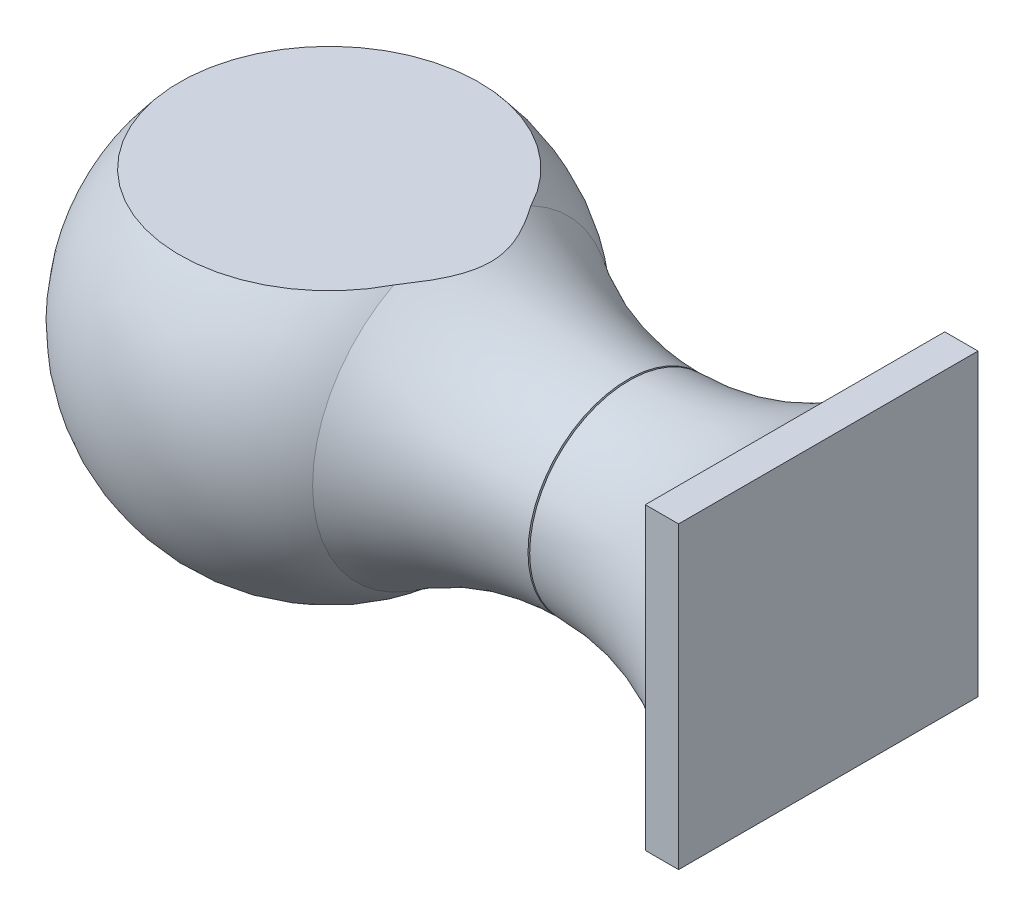
ISO-10303-21;
HEADER;
FILE_DESCRIPTION(('STEP AP214'),'2;1');
FILE_NAME('part.step','',(''),(''),'','','');
FILE_SCHEMA(('AUTOMOTIVE_DESIGN { 1 0 10303 214 1 1 1 1 }'));
ENDSEC;
DATA;
#1=APPLICATION_CONTEXT('core data for automotive mechanical design processes');
#2=APPLICATION_PROTOCOL_DEFINITION('international standard','automotive_design',2000,#1);
#3=PRODUCT_CONTEXT('',#1,'mechanical');
#4=PRODUCT('Part','Part','',(#3));
#5=PRODUCT_RELATED_PRODUCT_CATEGORY('part','',(#4));
#6=PRODUCT_DEFINITION_FORMATION('','',#4);
#7=PRODUCT_DEFINITION_CONTEXT('part definition',#1,'design');
#8=PRODUCT_DEFINITION('design','',#6,#7);
#9=PRODUCT_DEFINITION_SHAPE('','',#8);
#10=(LENGTH_UNIT() NAMED_UNIT(*) SI_UNIT(.MILLI.,.METRE.));
#11=(NAMED_UNIT(*) PLANE_ANGLE_UNIT() SI_UNIT($,.RADIAN.));
#12=(NAMED_UNIT(*) SI_UNIT($,.STERADIAN.) SOLID_ANGLE_UNIT());
#13=UNCERTAINTY_MEASURE_WITH_UNIT(LENGTH_MEASURE(1.E-05),#10,'distance_accuracy_value','');
#14=(GEOMETRIC_REPRESENTATION_CONTEXT(3) GLOBAL_UNCERTAINTY_ASSIGNED_CONTEXT((#13)) GLOBAL_UNIT_ASSIGNED_CONTEXT((#10,
#11,#12)) REPRESENTATION_CONTEXT('',''));
#15=CARTESIAN_POINT('',(0.,0.,0.));
#16=DIRECTION('',(0.,0.,1.));
#17=DIRECTION('',(1.,0.,0.));
#18=AXIS2_PLACEMENT_3D('',#15,#16,#17);
#19=CARTESIAN_POINT('',(0.,0.,0.));
#20=DIRECTION('',(-1.,0.,0.));
#21=DIRECTION('',(0.,0.,1.));
#22=AXIS2_PLACEMENT_3D('',#19,#20,#21);
#23=TOROIDAL_SURFACE('',#22,120.833333333333,90.8333333333334);
#24=CARTESIAN_POINT('',(0.249999999999993,0.,0.));
#25=DIRECTION('',(-1.,0.,0.));
#26=DIRECTION('',(0.,0.,1.));
#27=AXIS2_PLACEMENT_3D('',#24,#25,#26);
#28=CIRCLE('',#27,30.0003440373488);
#29=CARTESIAN_POINT('',(0.249999999999989,0.,30.0003440373488));
#30=VERTEX_POINT('',#29);
#31=EDGE_CURVE('E12',#30,#30,#28,.T.);
#32=ORIENTED_EDGE('',*,*,#31,.F.);
#33=EDGE_LOOP('',(#32));
#34=FACE_BOUND('',#33,.T.);
#35=CARTESIAN_POINT('',(50.,0.,0.));
#36=DIRECTION('',(-1.,0.,0.));
#37=DIRECTION('',(0.,0.,1.));
#38=AXIS2_PLACEMENT_3D('',#35,#36,#37);
#39=CIRCLE('',#38,45.);
#40=CARTESIAN_POINT('',(50.,0.,45.));
#41=VERTEX_POINT('',#40);
#42=CARTESIAN_POINT('',(50.,45.,0.));
#43=VERTEX_POINT('',#42);
#44=EDGE_CURVE('E50',#41,#43,#39,.T.);
#45=ORIENTED_EDGE('',*,*,#44,.T.);
#46=CARTESIAN_POINT('',(50.,0.,-45.));
#47=VERTEX_POINT('',#46);
#48=EDGE_CURVE('E65',#43,#47,#39,.T.);
#49=ORIENTED_EDGE('',*,*,#48,.T.);
#50=CARTESIAN_POINT('',(50.,-45.,0.));
#51=VERTEX_POINT('',#50);
#52=EDGE_CURVE('E125',#47,#51,#39,.T.);
#53=ORIENTED_EDGE('',*,*,#52,.T.);
#54=EDGE_CURVE('E122',#51,#41,#39,.T.);
#55=ORIENTED_EDGE('',*,*,#54,.T.);
#56=EDGE_LOOP('',(#45,#49,#53,#55));
#57=FACE_BOUND('',#56,.T.);
#58=ADVANCED_FACE('F43',(#34,#57),#23,.F.);
#59=CARTESIAN_POINT('',(0.250000000000007,0.,-30.0003440373488));
#60=DIRECTION('',(1.,0.,0.));
#61=DIRECTION('',(0.,0.,-1.));
#62=AXIS2_PLACEMENT_3D('',#59,#60,#61);
#63=PLANE('',#62);
#64=ORIENTED_EDGE('',*,*,#31,.T.);
#65=EDGE_LOOP('',(#64));
#66=FACE_BOUND('',#65,.T.);
#67=ADVANCED_FACE('F171',(#66),#63,.F.);
#68=CARTESIAN_POINT('',(50.,0.,0.));
#69=DIRECTION('',(1.,0.,0.));
#70=DIRECTION('',(0.,0.,-1.));
#71=AXIS2_PLACEMENT_3D('',#68,#69,#70);
#72=PLANE('',#71);
#73=ORIENTED_EDGE('',*,*,#44,.F.);
#74=DIRECTION('',(0.,-1.,0.));
#75=VECTOR('',#74,1.);
#76=CARTESIAN_POINT('',(50.,45.,45.));
#77=LINE('',#76,#75);
#78=CARTESIAN_POINT('',(50.,45.,45.));
#79=VERTEX_POINT('',#78);
#80=EDGE_CURVE('E57',#79,#41,#77,.T.);
#81=ORIENTED_EDGE('',*,*,#80,.F.);
#82=DIRECTION('',(0.,0.,1.));
#83=VECTOR('',#82,1.);
#84=CARTESIAN_POINT('',(50.,45.,45.));
#85=LINE('',#84,#83);
#86=EDGE_CURVE('E144',#43,#79,#85,.T.);
#87=ORIENTED_EDGE('',*,*,#86,.F.);
#88=EDGE_LOOP('',(#73,#81,#87));
#89=FACE_BOUND('',#88,.T.);
#90=ADVANCED_FACE('F160',(#89),#72,.F.);
#91=ORIENTED_EDGE('',*,*,#48,.F.);
#92=CARTESIAN_POINT('',(50.,45.,-45.));
#93=VERTEX_POINT('',#92);
#94=EDGE_CURVE('E141',#93,#43,#85,.T.);
#95=ORIENTED_EDGE('',*,*,#94,.F.);
#96=DIRECTION('',(0.,1.,0.));
#97=VECTOR('',#96,1.);
#98=CARTESIAN_POINT('',(50.,45.,-45.));
#99=LINE('',#98,#97);
#100=EDGE_CURVE('E121',#47,#93,#99,.T.);
#101=ORIENTED_EDGE('',*,*,#100,.F.);
#102=EDGE_LOOP('',(#91,#95,#101));
#103=FACE_BOUND('',#102,.T.);
#104=ADVANCED_FACE('F140',(#103),#72,.F.);
#105=ORIENTED_EDGE('',*,*,#52,.F.);
#106=CARTESIAN_POINT('',(50.,-45.,-45.));
#107=VERTEX_POINT('',#106);
#108=EDGE_CURVE('E137',#107,#47,#99,.T.);
#109=ORIENTED_EDGE('',*,*,#108,.F.);
#110=DIRECTION('',(0.,0.,-1.));
#111=VECTOR('',#110,1.);
#112=CARTESIAN_POINT('',(50.,-45.,45.));
#113=LINE('',#112,#111);
#114=EDGE_CURVE('E138',#51,#107,#113,.T.);
#115=ORIENTED_EDGE('',*,*,#114,.F.);
#116=EDGE_LOOP('',(#105,#109,#115));
#117=FACE_BOUND('',#116,.T.);
#118=ADVANCED_FACE('F136',(#117),#72,.F.);
#119=CARTESIAN_POINT('',(60.,45.,-45.));
#120=DIRECTION('',(0.,0.,1.));
#121=DIRECTION('',(0.,-1.,0.));
#122=AXIS2_PLACEMENT_3D('',#119,#120,#121);
#123=PLANE('',#122);
#124=ORIENTED_EDGE('',*,*,#108,.T.);
#125=ORIENTED_EDGE('',*,*,#100,.T.);
#126=DIRECTION('',(-1.,0.,0.));
#127=VECTOR('',#126,1.);
#128=CARTESIAN_POINT('',(60.,45.,-45.));
#129=LINE('',#128,#127);
#130=CARTESIAN_POINT('',(60.,45.,-45.));
#131=VERTEX_POINT('',#130);
#132=EDGE_CURVE('E103',#131,#93,#129,.T.);
#133=ORIENTED_EDGE('',*,*,#132,.F.);
#134=DIRECTION('',(0.,1.,0.));
#135=VECTOR('',#134,1.);
#136=CARTESIAN_POINT('',(60.,45.,-45.));
#137=LINE('',#136,#135);
#138=CARTESIAN_POINT('',(60.,-45.,-45.));
#139=VERTEX_POINT('',#138);
#140=EDGE_CURVE('E108',#139,#131,#137,.T.);
#141=ORIENTED_EDGE('',*,*,#140,.F.);
#142=DIRECTION('',(-1.,0.,0.));
#143=VECTOR('',#142,1.);
#144=CARTESIAN_POINT('',(60.,-45.,-45.));
#145=LINE('',#144,#143);
#146=EDGE_CURVE('E143',#139,#107,#145,.T.);
#147=ORIENTED_EDGE('',*,*,#146,.T.);
#148=EDGE_LOOP('',(#124,#125,#133,#141,#147));
#149=FACE_BOUND('',#148,.T.);
#150=ADVANCED_FACE('F120',(#149),#123,.F.);
#151=CARTESIAN_POINT('',(60.,45.,45.));
#152=DIRECTION('',(0.,-1.,0.));
#153=DIRECTION('',(0.,0.,-1.));
#154=AXIS2_PLACEMENT_3D('',#151,#152,#153);
#155=PLANE('',#154);
#156=ORIENTED_EDGE('',*,*,#94,.T.);
#157=ORIENTED_EDGE('',*,*,#86,.T.);
#158=DIRECTION('',(-1.,0.,0.));
#159=VECTOR('',#158,1.);
#160=CARTESIAN_POINT('',(60.,45.,45.));
#161=LINE('',#160,#159);
#162=CARTESIAN_POINT('',(60.,45.,45.));
#163=VERTEX_POINT('',#162);
#164=EDGE_CURVE('E104',#163,#79,#161,.T.);
#165=ORIENTED_EDGE('',*,*,#164,.F.);
#166=DIRECTION('',(0.,0.,1.));
#167=VECTOR('',#166,1.);
#168=CARTESIAN_POINT('',(60.,45.,45.));
#169=LINE('',#168,#167);
#170=EDGE_CURVE('E98',#131,#163,#169,.T.);
#171=ORIENTED_EDGE('',*,*,#170,.F.);
#172=ORIENTED_EDGE('',*,*,#132,.T.);
#173=EDGE_LOOP('',(#156,#157,#165,#171,#172));
#174=FACE_BOUND('',#173,.T.);
#175=ADVANCED_FACE('F101',(#174),#155,.F.);
#176=CARTESIAN_POINT('',(60.,45.,45.));
#177=DIRECTION('',(0.,0.,-1.));
#178=DIRECTION('',(-1.,0.,0.));
#179=AXIS2_PLACEMENT_3D('',#176,#177,#178);
#180=PLANE('',#179);
#181=ORIENTED_EDGE('',*,*,#80,.T.);
#182=CARTESIAN_POINT('',(50.,-45.,45.));
#183=VERTEX_POINT('',#182);
#184=EDGE_CURVE('E149',#41,#183,#77,.T.);
#185=ORIENTED_EDGE('',*,*,#184,.T.);
#186=DIRECTION('',(-1.,0.,0.));
#187=VECTOR('',#186,1.);
#188=CARTESIAN_POINT('',(60.,-45.,45.));
#189=LINE('',#188,#187);
#190=CARTESIAN_POINT('',(60.,-45.,45.));
#191=VERTEX_POINT('',#190);
#192=EDGE_CURVE('E126',#191,#183,#189,.T.);
#193=ORIENTED_EDGE('',*,*,#192,.F.);
#194=DIRECTION('',(0.,-1.,0.));
#195=VECTOR('',#194,1.);
#196=CARTESIAN_POINT('',(60.,45.,45.));
#197=LINE('',#196,#195);
#198=EDGE_CURVE('E107',#163,#191,#197,.T.);
#199=ORIENTED_EDGE('',*,*,#198,.F.);
#200=ORIENTED_EDGE('',*,*,#164,.T.);
#201=EDGE_LOOP('',(#181,#185,#193,#199,#200));
#202=FACE_BOUND('',#201,.T.);
#203=ADVANCED_FACE('F161',(#202),#180,.F.);
#204=CARTESIAN_POINT('',(60.,-45.,45.));
#205=DIRECTION('',(0.,1.,0.));
#206=DIRECTION('',(0.,0.,1.));
#207=AXIS2_PLACEMENT_3D('',#204,#205,#206);
#208=PLANE('',#207);
#209=EDGE_CURVE('E117',#183,#51,#113,.T.);
#210=ORIENTED_EDGE('',*,*,#209,.T.);
#211=ORIENTED_EDGE('',*,*,#114,.T.);
#212=ORIENTED_EDGE('',*,*,#146,.F.);
#213=DIRECTION('',(0.,0.,-1.));
#214=VECTOR('',#213,1.);
#215=CARTESIAN_POINT('',(60.,-45.,45.));
#216=LINE('',#215,#214);
#217=EDGE_CURVE('E113',#191,#139,#216,.T.);
#218=ORIENTED_EDGE('',*,*,#217,.F.);
#219=ORIENTED_EDGE('',*,*,#192,.T.);
#220=EDGE_LOOP('',(#210,#211,#212,#218,#219));
#221=FACE_BOUND('',#220,.T.);
#222=ADVANCED_FACE('F156',(#221),#208,.F.);
#223=CARTESIAN_POINT('',(60.,0.,0.));
#224=DIRECTION('',(1.,0.,0.));
#225=DIRECTION('',(0.,0.,-1.));
#226=AXIS2_PLACEMENT_3D('',#223,#224,#225);
#227=PLANE('',#226);
#228=ORIENTED_EDGE('',*,*,#140,.T.);
#229=ORIENTED_EDGE('',*,*,#170,.T.);
#230=ORIENTED_EDGE('',*,*,#198,.T.);
#231=ORIENTED_EDGE('',*,*,#217,.T.);
#232=EDGE_LOOP('',(#228,#229,#230,#231));
#233=FACE_BOUND('',#232,.T.);
#234=ADVANCED_FACE('F111',(#233),#227,.T.);
#235=ORIENTED_EDGE('',*,*,#54,.F.);
#236=ORIENTED_EDGE('',*,*,#209,.F.);
#237=ORIENTED_EDGE('',*,*,#184,.F.);
#238=EDGE_LOOP('',(#235,#236,#237));
#239=FACE_BOUND('',#238,.T.);
#240=ADVANCED_FACE('F158',(#239),#72,.F.);
#241=CLOSED_SHELL('',(#58,#67,#90,#104,#118,#150,#175,#203,#222,#234,#240));
#242=MANIFOLD_SOLID_BREP('B2',#241);
#243=CARTESIAN_POINT('',(0.,0.,0.));
#244=DIRECTION('',(-1.,0.,0.));
#245=DIRECTION('',(0.,0.,1.));
#246=AXIS2_PLACEMENT_3D('',#243,#244,#245);
#247=TOROIDAL_SURFACE('',#246,120.833333333333,90.8333333333334);
#248=CARTESIAN_POINT('',(-0.250000000000007,0.,0.));
#249=DIRECTION('',(-1.,0.,0.));
#250=DIRECTION('',(0.,0.,1.));
#251=AXIS2_PLACEMENT_3D('',#248,#249,#250);
#252=CIRCLE('',#251,30.0003440373488);
#253=CARTESIAN_POINT('',(-0.250000000000011,0.,30.0003440373488));
#254=VERTEX_POINT('',#253);
#255=EDGE_CURVE('E272',#254,#254,#252,.T.);
#256=ORIENTED_EDGE('',*,*,#255,.T.);
#257=EDGE_LOOP('',(#256));
#258=FACE_BOUND('',#257,.T.);
#259=CARTESIAN_POINT('',(-87.8550748587916,40.,138.231295034191));
#260=CARTESIAN_POINT('',(-88.2383912429375,40.,136.711767975198));
#261=CARTESIAN_POINT('',(-88.5846025140319,40.,135.182922555662));
#262=CARTESIAN_POINT('',(-89.2028218843063,40.,132.110400520563));
#263=CARTESIAN_POINT('',(-89.4748348727282,40.,130.566724889168));
#264=CARTESIAN_POINT('',(-89.9445743108296,40.,127.469076104286));
#265=CARTESIAN_POINT('',(-90.1423452276667,40.,125.915109683911));
#266=CARTESIAN_POINT('',(-90.4641726133029,40.,122.799555303401));
#267=CARTESIAN_POINT('',(-90.5882282439836,40.,121.237967256814));
#268=CARTESIAN_POINT('',(-90.7625473038883,40.,118.122169357454));
#269=CARTESIAN_POINT('',(-90.8133445802749,40.,116.567989242132));
#270=CARTESIAN_POINT('',(-90.843649251691,40.,113.458922966461));
#271=CARTESIAN_POINT('',(-90.8231555578016,40.,111.90403679569));
#272=CARTESIAN_POINT('',(-90.7118966260783,40.,108.796759119222));
#273=CARTESIAN_POINT('',(-90.6211295852939,40.,107.244367678556));
#274=CARTESIAN_POINT('',(-90.3705684281291,40.,104.145197264501));
#275=CARTESIAN_POINT('',(-90.2107754496887,40.,102.598418199013));
#276=CARTESIAN_POINT('',(-89.8418505748187,40.,99.6585213737398));
#277=CARTESIAN_POINT('',(-89.6387752198908,40.,98.2646384654545));
#278=CARTESIAN_POINT('',(-89.1784265012078,40.,95.4858554753901));
#279=CARTESIAN_POINT('',(-88.9211531599875,40.,94.1009553898762));
#280=CARTESIAN_POINT('',(-88.3538199510767,40.,91.3421689375869));
#281=CARTESIAN_POINT('',(-88.0437653020902,40.,89.9682814959951));
#282=CARTESIAN_POINT('',(-87.3723700102718,40.,87.2331035808139));
#283=CARTESIAN_POINT('',(-87.0110291490367,40.,85.8718131608956));
#284=CARTESIAN_POINT('',(-86.2382681390828,40.,83.1618287287351));
#285=CARTESIAN_POINT('',(-85.8267903471287,40.,81.8131511720714));
#286=CARTESIAN_POINT('',(-84.9558750115302,40.,79.1313702094424));
#287=CARTESIAN_POINT('',(-84.4964368982802,40.,77.7982669886562));
#288=CARTESIAN_POINT('',(-83.531545321331,40.,75.1488905991692));
#289=CARTESIAN_POINT('',(-83.0260934301635,40.,73.8326168570689));
#290=CARTESIAN_POINT('',(-81.971215975028,40.,71.2178389718339));
#291=CARTESIAN_POINT('',(-81.421790880698,40.,69.9193346390936));
#292=CARTESIAN_POINT('',(-80.3492225028306,40.,67.4947069700421));
#293=CARTESIAN_POINT('',(-79.8307672958543,40.,66.366504526979));
#294=CARTESIAN_POINT('',(-78.7630273773241,40.,64.1247878064038));
#295=CARTESIAN_POINT('',(-78.2137425892738,40.,63.0112735653456));
#296=CARTESIAN_POINT('',(-77.0860607682578,40.,60.7992113876333));
#297=CARTESIAN_POINT('',(-76.5076660121614,40.,59.7006622889775));
#298=CARTESIAN_POINT('',(-75.3234873154983,40.,57.5184372251067));
#299=CARTESIAN_POINT('',(-74.7177032853062,40.,56.4347613085761));
#300=CARTESIAN_POINT('',(-73.4822214357812,40.,54.2848737988823));
#301=CARTESIAN_POINT('',(-72.852589546528,40.,53.2186242733317));
#302=CARTESIAN_POINT('',(-71.5699251134418,40.,51.1003125269406));
#303=CARTESIAN_POINT('',(-70.9168925814336,40.,50.0482502989314));
#304=CARTESIAN_POINT('',(-69.5895831926166,40.,47.9576904890895));
#305=CARTESIAN_POINT('',(-68.9153071658478,40.,46.9191923795078));
#306=CARTESIAN_POINT('',(-67.5477961649785,40.,44.8547755792276));
#307=CARTESIAN_POINT('',(-66.8545612446727,40.,43.8288568528478));
#308=CARTESIAN_POINT('',(-65.6387938932389,40.,42.0604757649207));
#309=CARTESIAN_POINT('',(-65.1200528985619,40.,41.315399658316));
#310=CARTESIAN_POINT('',(-64.0748552283102,40.,39.8306777546726));
#311=CARTESIAN_POINT('',(-63.5483985243465,40.,39.0910319776292));
#312=CARTESIAN_POINT('',(-62.4889418106755,40.,37.6163543150913));
#313=CARTESIAN_POINT('',(-61.9559412583119,40.,36.8813228199852));
#314=CARTESIAN_POINT('',(-60.8847903859875,40.,35.4150241560944));
#315=CARTESIAN_POINT('',(-60.3466400545627,40.,34.6837569956951));
#316=CARTESIAN_POINT('',(-59.2622193155634,40.,33.2178281306752));
#317=CARTESIAN_POINT('',(-58.7159186079196,40.,32.4831888757764));
#318=CARTESIAN_POINT('',(-57.6214276724643,40.,31.0153201115569));
#319=CARTESIAN_POINT('',(-57.0732374417288,40.,30.2820906044205));
#320=CARTESIAN_POINT('',(-55.9773228939555,40.,28.8158162420443));
#321=CARTESIAN_POINT('',(-55.4295984788675,40.,28.0827714602335));
#322=CARTESIAN_POINT('',(-54.3368597987349,40.,26.6146625047254));
#323=CARTESIAN_POINT('',(-53.7918455268622,40.,25.879598336123));
#324=CARTESIAN_POINT('',(-52.6998803957834,40.,24.394782965937));
#325=CARTESIAN_POINT('',(-52.1530115533898,40.,23.6449712533947));
#326=CARTESIAN_POINT('',(-51.0691128260697,40.,22.1382096521714));
#327=CARTESIAN_POINT('',(-50.5320832154647,40.,21.3812595653586));
#328=CARTESIAN_POINT('',(-49.4716676996856,40.,19.8551949823464));
#329=CARTESIAN_POINT('',(-48.9483164756677,40.,19.0860562654043));
#330=CARTESIAN_POINT('',(-47.9231554922118,40.,17.5335182056095));
#331=CARTESIAN_POINT('',(-47.4213445660684,40.,16.7501196384065));
#332=CARTESIAN_POINT('',(-46.4551776913414,40.,15.1764588575644));
#333=CARTESIAN_POINT('',(-45.9903746701846,40.,14.3864733726642));
#334=CARTESIAN_POINT('',(-45.1009366457092,40.,12.7835969912379));
#335=CARTESIAN_POINT('',(-44.6763150575173,40.,11.9706985616468));
#336=CARTESIAN_POINT('',(-43.8836659895336,40.,10.3218257108937));
#337=CARTESIAN_POINT('',(-43.5153976644067,40.,9.4859685915096));
#338=CARTESIAN_POINT('',(-42.8516738643224,40.,7.78616736442022));
#339=CARTESIAN_POINT('',(-42.5561375359658,40.,6.92225566483583));
#340=CARTESIAN_POINT('',(-42.1401495647272,40.,5.45703399463983));
#341=CARTESIAN_POINT('',(-41.9940944581884,40.,4.86299945601542));
#342=CARTESIAN_POINT('',(-41.7496255152955,40.,3.66487964925072));
#343=CARTESIAN_POINT('',(-41.6512244240029,40.,3.06079173697042));
#344=CARTESIAN_POINT('',(-41.5069413702395,40.,1.84738248070523));
#345=CARTESIAN_POINT('',(-41.4609664737747,40.,1.23807233250742));
#346=CARTESIAN_POINT('',(-41.4236140961947,40.,0.0178065751980829));
#347=CARTESIAN_POINT('',(-41.432231804847,40.,-0.593148884201225));
#348=CARTESIAN_POINT('',(-41.5035539183115,40.,-1.81115948144233));
#349=CARTESIAN_POINT('',(-41.5661977724191,40.,-2.41821821952051));
#350=CARTESIAN_POINT('',(-41.7423177713198,40.,-3.62488550821567));
#351=CARTESIAN_POINT('',(-41.8558002998395,40.,-4.22449311348572));
#352=CARTESIAN_POINT('',(-42.1288023997133,40.,-5.41455502584944));
#353=CARTESIAN_POINT('',(-42.2884338978939,40.,-6.00498335679279));
#354=CARTESIAN_POINT('',(-42.6474653193547,40.,-7.17328865942297));
#355=CARTESIAN_POINT('',(-42.8468555362817,40.,-7.7511686564442));
#356=CARTESIAN_POINT('',(-43.4220896206071,40.,-9.27175848720113));
#357=CARTESIAN_POINT('',(-43.8274905693989,40.,-10.2033115960679));
#358=CARTESIAN_POINT('',(-44.4862249126728,40.,-11.576065872185));
#359=CARTESIAN_POINT('',(-44.7143904063519,40.,-12.0298133835968));
#360=CARTESIAN_POINT('',(-45.1850894378512,40.,-12.9298165951953));
#361=CARTESIAN_POINT('',(-45.4276223990241,40.,-13.3760725951372));
#362=CARTESIAN_POINT('',(-45.9256514669732,40.,-14.2633687498973));
#363=CARTESIAN_POINT('',(-46.1811912317225,40.,-14.7043842435053));
#364=CARTESIAN_POINT('',(-46.7024806891961,40.,-15.5803551907627));
#365=CARTESIAN_POINT('',(-46.9682308644234,40.,-16.0153103566986));
#366=CARTESIAN_POINT('',(-47.5081286000785,40.,-16.8797089640144));
#367=CARTESIAN_POINT('',(-47.7822725862484,40.,-17.3091546438778));
#368=CARTESIAN_POINT('',(-48.3376424596495,40.,-18.1634489600322));
#369=CARTESIAN_POINT('',(-48.618868551585,40.,-18.5882974629358));
#370=CARTESIAN_POINT('',(-49.4790725774833,40.,-19.8685887628579));
#371=CARTESIAN_POINT('',(-50.0670962216801,40.,-20.7179495234648));
#372=CARTESIAN_POINT('',(-51.2587826639487,40.,-22.4056100021045));
#373=CARTESIAN_POINT('',(-51.8624463896365,40.,-23.2439090595948));
#374=CARTESIAN_POINT('',(-53.078023246699,40.,-24.9118853864999));
#375=CARTESIAN_POINT('',(-53.6899172036693,40.,-25.7415766745329));
#376=CARTESIAN_POINT('',(-54.9183927984169,40.,-27.3974513559033));
#377=CARTESIAN_POINT('',(-55.5349743782602,40.,-28.2236347923981));
#378=CARTESIAN_POINT('',(-56.8623016478244,40.,-30.0001179325758));
#379=CARTESIAN_POINT('',(-57.5731962722396,40.,-30.9503061683121));
#380=CARTESIAN_POINT('',(-58.9915568394304,40.,-32.8532455431788));
#381=CARTESIAN_POINT('',(-59.6990227826195,40.,-33.8059966819998));
#382=CARTESIAN_POINT('',(-61.1067446825342,40.,-35.7168195616458));
#383=CARTESIAN_POINT('',(-61.8070006614501,40.,-36.6748912860813));
#384=CARTESIAN_POINT('',(-63.1971141356019,40.,-38.5985633128315));
#385=CARTESIAN_POINT('',(-63.8869716416561,40.,-39.5641636073119));
#386=CARTESIAN_POINT('',(-65.2538673366908,40.,-41.5051221007632));
#387=CARTESIAN_POINT('',(-65.9308990584574,40.,-42.4804848623966));
#388=CARTESIAN_POINT('',(-67.2693522642215,40.,-44.4418797408096));
#389=CARTESIAN_POINT('',(-67.9307737453629,40.,-45.4279118595413));
#390=CARTESIAN_POINT('',(-69.235813776323,40.,-47.4117198235705));
#391=CARTESIAN_POINT('',(-69.8794321261539,40.,-48.4094958006108));
#392=CARTESIAN_POINT('',(-71.1468458205056,40.,-50.4175737321039));
#393=CARTESIAN_POINT('',(-71.7706411805121,40.,-51.4278756767705));
#394=CARTESIAN_POINT('',(-72.9897695401763,40.,-53.4503218111751));
#395=CARTESIAN_POINT('',(-73.5853409894081,40.,-54.462322106624));
#396=CARTESIAN_POINT('',(-74.7536045741771,40.,-56.4994809949337));
#397=CARTESIAN_POINT('',(-75.3262962583351,40.,-57.5246398468641));
#398=CARTESIAN_POINT('',(-76.4472229166349,40.,-59.5883019406393));
#399=CARTESIAN_POINT('',(-76.9954571986975,40.,-60.6268055590358));
#400=CARTESIAN_POINT('',(-78.0659553050402,40.,-62.7171192237341));
#401=CARTESIAN_POINT('',(-78.5882185154194,40.,-63.7689295838426));
#402=CARTESIAN_POINT('',(-80.1135114011582,40.,-66.943354815564));
#403=CARTESIAN_POINT('',(-81.0755479260266,40.,-69.0858863556183));
#404=CARTESIAN_POINT('',(-82.8793855583346,40.,-73.420780598634));
#405=CARTESIAN_POINT('',(-83.7212042550305,40.,-75.6131359572751));
#406=CARTESIAN_POINT('',(-84.986699997315,40.,-79.2205348514164));
#407=CARTESIAN_POINT('',(-85.4495707433812,40.,-80.6219231508175));
#408=CARTESIAN_POINT('',(-86.3219893065518,40.,-83.4411621853778));
#409=CARTESIAN_POINT('',(-86.7315404510353,40.,-84.8590118872526));
#410=CARTESIAN_POINT('',(-87.4953013272468,40.,-87.7093971306747));
#411=CARTESIAN_POINT('',(-87.849516544036,40.,-89.1419312016444));
#412=CARTESIAN_POINT('',(-88.5008324939349,40.,-92.0199638235429));
#413=CARTESIAN_POINT('',(-88.7979324816724,40.,-93.4654625434068));
#414=CARTESIAN_POINT('',(-89.3339563963622,40.,-96.3706538275161));
#415=CARTESIAN_POINT('',(-89.5727452525135,40.,-97.8303713521292));
#416=CARTESIAN_POINT('',(-89.9897493862829,40.,-100.758428964718));
#417=CARTESIAN_POINT('',(-90.1679653103155,40.,-102.226768960507));
#418=CARTESIAN_POINT('',(-90.4624727490284,40.,-105.169513421965));
#419=CARTESIAN_POINT('',(-90.5787708759105,40.,-106.643917223127));
#420=CARTESIAN_POINT('',(-90.7483113171641,40.,-109.596234175217));
#421=CARTESIAN_POINT('',(-90.8015570471215,40.,-111.074147131706));
#422=CARTESIAN_POINT('',(-90.8538151447059,40.,-114.713674727863));
#423=CARTESIAN_POINT('',(-90.8164379038032,40.,-116.875913389802));
#424=CARTESIAN_POINT('',(-90.6024790623049,40.,-121.193134517587));
#425=CARTESIAN_POINT('',(-90.4259287945795,40.,-123.348118507065));
#426=CARTESIAN_POINT('',(-90.0558361047926,40.,-126.567203437684));
#427=CARTESIAN_POINT('',(-89.91500182876,40.,-127.63759011684));
#428=CARTESIAN_POINT('',(-89.5981636203573,40.,-129.773180187175));
#429=CARTESIAN_POINT('',(-89.4221599745509,40.,-130.838383620515));
#430=CARTESIAN_POINT('',(-89.0348656318423,40.,-132.96275197828));
#431=CARTESIAN_POINT('',(-88.8235620529302,40.,-134.021914551757));
#432=CARTESIAN_POINT('',(-88.3657306731852,40.,-136.132624878771));
#433=CARTESIAN_POINT('',(-88.1192020135189,40.,-137.184172445987));
#434=CARTESIAN_POINT('',(-87.8550748587915,40.,-138.231295034191));
#435=B_SPLINE_CURVE_WITH_KNOTS('',3,(#259,#260,#261,#262,#263,#264,#265,#266,#267,#268,#269,
#270,#271,#272,#273,#274,#275,#276,#277,#278,#279,#280,#281,#282,#283,#284,#285,#286,#287,#288,
#289,#290,#291,#292,#293,#294,#295,#296,#297,#298,#299,#300,#301,#302,#303,#304,#305,#306,#307,
#308,#309,#310,#311,#312,#313,#314,#315,#316,#317,#318,#319,#320,#321,#322,#323,#324,#325,#326,
#327,#328,#329,#330,#331,#332,#333,#334,#335,#336,#337,#338,#339,#340,#341,#342,#343,#344,#345,
#346,#347,#348,#349,#350,#351,#352,#353,#354,#355,#356,#357,#358,#359,#360,#361,#362,#363,#364,
#365,#366,#367,#368,#369,#370,#371,#372,#373,#374,#375,#376,#377,#378,#379,#380,#381,#382,#383,
#384,#385,#386,#387,#388,#389,#390,#391,#392,#393,#394,#395,#396,#397,#398,#399,#400,#401,#402,
#403,#404,#405,#406,#407,#408,#409,#410,#411,#412,#413,#414,#415,#416,#417,#418,#419,#420,#421,
#422,#423,#424,#425,#426,#427,#428,#429,#430,#431,#432,#433,#434),.UNSPECIFIED.,.F.,.F.,(4,2,2,
2,2,2,2,2,2,2,2,2,2,2,2,2,2,2,2,2,2,2,2,2,2,2,2,2,2,2,2,2,2,2,2,2,2,2,2,2,2,2,2,2,2,2,2,2,2,2,2,
2,2,2,2,2,2,2,2,2,2,2,2,2,2,2,2,2,2,2,2,2,2,2,2,2,2,2,2,2,2,2,2,2,2,2,2,4),(0.,4.70086345428503,
9.40141707371301,14.0991507957538,18.7969379284633,23.4603153650208,28.1237640316674,
32.7873323488673,37.4508237868607,41.6755503980579,45.900275252669,50.1245826338012,
54.348908004765,58.5781368087226,62.8074158472624,67.0365504034259,71.265639798067,
74.9900451480692,78.7144597397353,82.4385834734346,86.1627193944036,89.8772194810738,
93.5917176907561,97.3060709446574,101.020413660419,103.743977751288,106.467551865705,
109.191353382097,111.91516096338,114.661653042032,117.408149372569,120.153364451002,
122.898572609564,125.682685536849,128.466875968462,131.257549397951,134.04807148262,
136.796965105483,139.5467732702,142.284479577298,145.019128591662,146.852643066725,
148.686647644607,150.517396071094,152.347983189968,154.176521310048,156.005289100967,
157.838530024778,159.671323943586,162.714773706944,164.238285000065,165.761735187459,
167.290687982904,168.819713119602,170.348095981006,171.876523070256,174.975344089286,
178.074349322592,181.167080820823,184.259774158215,187.819839177037,191.379903766412,
194.939957395558,198.500007320611,202.06180697571,205.623607282473,209.185447583734,
212.747285102416,216.269738227669,219.792260810713,223.314883008602,226.837588434265,
233.879849918603,240.921079980814,245.347695110622,249.774033867521,254.199933593831,
258.625891075633,263.06200552835,267.498072638805,271.933665926572,276.36901892462,
282.85216747352,289.333856848453,292.572207359643,295.810531485504,299.050039965373,
302.28962744217),.UNSPECIFIED.);
#436=CARTESIAN_POINT('',(-50.,40.,20.6155281280883));
#437=VERTEX_POINT('',#436);
#438=CARTESIAN_POINT('',(-50.,40.,-20.6155281280883));
#439=VERTEX_POINT('',#438);
#440=EDGE_CURVE('E265',#437,#439,#435,.T.);
#441=ORIENTED_EDGE('',*,*,#440,.F.);
#442=CARTESIAN_POINT('',(-50.,0.,0.));
#443=DIRECTION('',(-1.,0.,0.));
#444=DIRECTION('',(0.,0.,1.));
#445=AXIS2_PLACEMENT_3D('',#442,#443,#444);
#446=CIRCLE('',#445,45.);
#447=EDGE_CURVE('E260',#439,#437,#446,.T.);
#448=ORIENTED_EDGE('',*,*,#447,.F.);
#449=EDGE_LOOP('',(#441,#448));
#450=FACE_BOUND('',#449,.T.);
#451=ADVANCED_FACE('F252',(#258,#450),#247,.F.);
#452=CARTESIAN_POINT('',(-90.,0.,0.));
#453=DIRECTION('',(-1.,0.,0.));
#454=DIRECTION('',(0.,0.,-1.));
#455=AXIS2_PLACEMENT_3D('',#452,#453,#454);
#456=SPHERICAL_SURFACE('',#455,60.2079728939615);
#457=CARTESIAN_POINT('',(-90.,40.,0.));
#458=DIRECTION('',(0.,1.,0.));
#459=DIRECTION('',(0.,0.,1.));
#460=AXIS2_PLACEMENT_3D('',#457,#458,#459);
#461=CIRCLE('',#460,45.);
#462=EDGE_CURVE('E41',#439,#437,#461,.T.);
#463=ORIENTED_EDGE('',*,*,#462,.F.);
#464=ORIENTED_EDGE('',*,*,#447,.T.);
#465=EDGE_LOOP('',(#463,#464));
#466=FACE_BOUND('',#465,.T.);
#467=ADVANCED_FACE('F274',(#466),#456,.T.);
#468=CARTESIAN_POINT('',(-0.249999999999994,0.,-30.0003440373488));
#469=DIRECTION('',(-1.,0.,0.));
#470=DIRECTION('',(0.,0.,1.));
#471=AXIS2_PLACEMENT_3D('',#468,#469,#470);
#472=PLANE('',#471);
#473=ORIENTED_EDGE('',*,*,#255,.F.);
#474=EDGE_LOOP('',(#473));
#475=FACE_BOUND('',#474,.T.);
#476=ADVANCED_FACE('F285',(#475),#472,.F.);
#477=CARTESIAN_POINT('',(0.,40.,0.));
#478=DIRECTION('',(0.,1.,0.));
#479=DIRECTION('',(0.,0.,1.));
#480=AXIS2_PLACEMENT_3D('',#477,#478,#479);
#481=PLANE('',#480);
#482=ORIENTED_EDGE('',*,*,#440,.T.);
#483=ORIENTED_EDGE('',*,*,#462,.T.);
#484=EDGE_LOOP('',(#482,#483));
#485=FACE_BOUND('',#484,.T.);
#486=ADVANCED_FACE('F267',(#485),#481,.T.);
#487=CLOSED_SHELL('',(#451,#467,#476,#486));
#488=MANIFOLD_SOLID_BREP('B6',#487);
#489=ADVANCED_BREP_SHAPE_REPRESENTATION('',(#18,#242,#488),#14);
#490=SHAPE_DEFINITION_REPRESENTATION(#9,#489);
ENDSEC;
END-ISO-10303-21;
